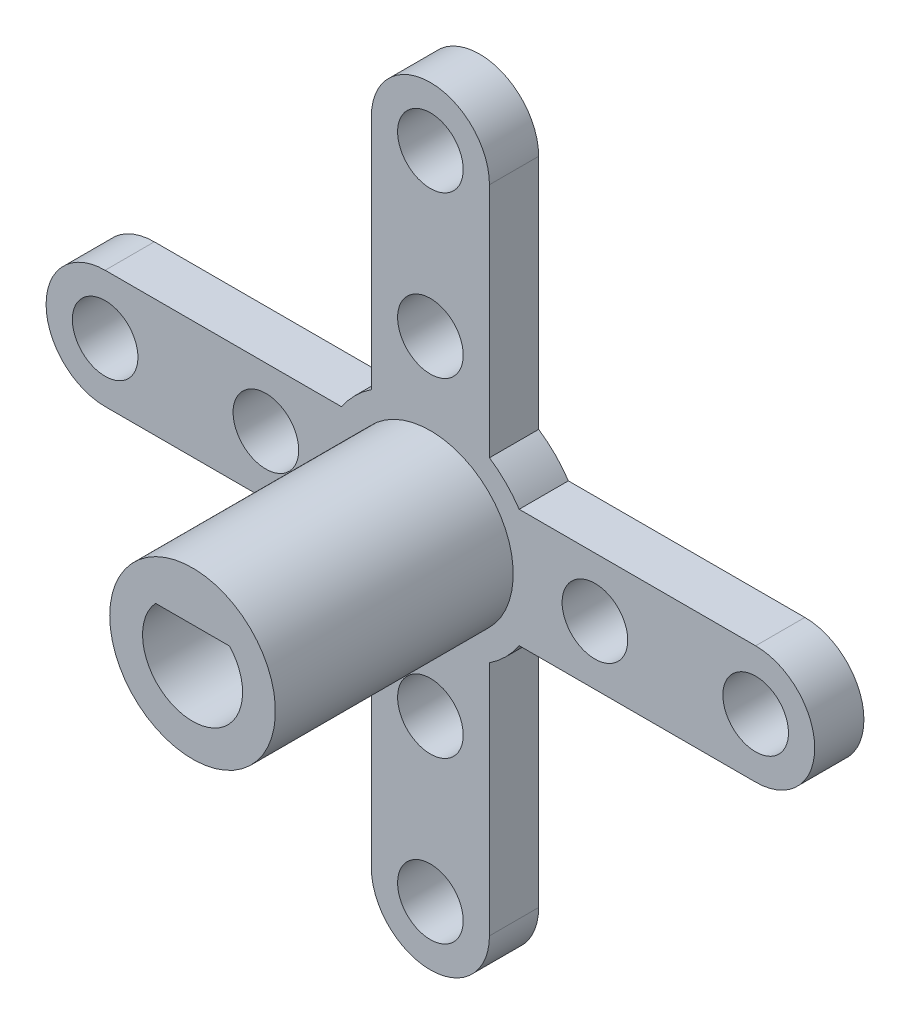
ISO-10303-21;
HEADER;
FILE_DESCRIPTION(('STEP AP214'),'2;1');
FILE_NAME('part.step','',(''),(''),'','','');
FILE_SCHEMA(('AUTOMOTIVE_DESIGN { 1 0 10303 214 1 1 1 1 }'));
ENDSEC;
DATA;
#1=APPLICATION_CONTEXT('core data for automotive mechanical design processes');
#2=APPLICATION_PROTOCOL_DEFINITION('international standard','automotive_design',2000,#1);
#3=PRODUCT_CONTEXT('',#1,'mechanical');
#4=PRODUCT('Part','Part','',(#3));
#5=PRODUCT_RELATED_PRODUCT_CATEGORY('part','',(#4));
#6=PRODUCT_DEFINITION_FORMATION('','',#4);
#7=PRODUCT_DEFINITION_CONTEXT('part definition',#1,'design');
#8=PRODUCT_DEFINITION('design','',#6,#7);
#9=PRODUCT_DEFINITION_SHAPE('','',#8);
#10=(LENGTH_UNIT() NAMED_UNIT(*) SI_UNIT(.MILLI.,.METRE.));
#11=(NAMED_UNIT(*) PLANE_ANGLE_UNIT() SI_UNIT($,.RADIAN.));
#12=(NAMED_UNIT(*) SI_UNIT($,.STERADIAN.) SOLID_ANGLE_UNIT());
#13=UNCERTAINTY_MEASURE_WITH_UNIT(LENGTH_MEASURE(1.E-05),#10,'distance_accuracy_value','');
#14=(GEOMETRIC_REPRESENTATION_CONTEXT(3) GLOBAL_UNCERTAINTY_ASSIGNED_CONTEXT((#13)) GLOBAL_UNIT_ASSIGNED_CONTEXT((#10,
#11,#12)) REPRESENTATION_CONTEXT('',''));
#15=CARTESIAN_POINT('',(0.,0.,0.));
#16=DIRECTION('',(0.,0.,1.));
#17=DIRECTION('',(1.,0.,0.));
#18=AXIS2_PLACEMENT_3D('',#15,#16,#17);
#19=CARTESIAN_POINT('',(0.,0.,1.5));
#20=DIRECTION('',(0.,0.,-1.));
#21=DIRECTION('',(-1.,0.,0.));
#22=AXIS2_PLACEMENT_3D('',#19,#20,#21);
#23=CYLINDRICAL_SURFACE('',#22,3.25);
#24=DIRECTION('',(0.,0.,-1.));
#25=VECTOR('',#24,1.);
#26=CARTESIAN_POINT('',(-2.70601182554696,-1.80000000000001,1.5));
#27=LINE('',#26,#25);
#28=CARTESIAN_POINT('',(-2.70601182554696,-1.80000000000001,1.5));
#29=VERTEX_POINT('',#28);
#30=CARTESIAN_POINT('',(-2.70601182554696,-1.80000000000001,0.));
#31=VERTEX_POINT('',#30);
#32=EDGE_CURVE('E295',#29,#31,#27,.T.);
#33=ORIENTED_EDGE('',*,*,#32,.T.);
#34=CARTESIAN_POINT('',(0.,0.,0.));
#35=DIRECTION('',(0.,0.,1.));
#36=DIRECTION('',(1.,0.,0.));
#37=AXIS2_PLACEMENT_3D('',#34,#35,#36);
#38=CIRCLE('',#37,3.25);
#39=CARTESIAN_POINT('',(-1.79999999999999,-2.70601182554697,0.));
#40=VERTEX_POINT('',#39);
#41=EDGE_CURVE('E341',#31,#40,#38,.T.);
#42=ORIENTED_EDGE('',*,*,#41,.T.);
#43=DIRECTION('',(0.,0.,-1.));
#44=VECTOR('',#43,1.);
#45=CARTESIAN_POINT('',(-1.79999999999999,-2.70601182554697,1.5));
#46=LINE('',#45,#44);
#47=CARTESIAN_POINT('',(-1.79999999999999,-2.70601182554697,1.5));
#48=VERTEX_POINT('',#47);
#49=EDGE_CURVE('E276',#48,#40,#46,.T.);
#50=ORIENTED_EDGE('',*,*,#49,.F.);
#51=CARTESIAN_POINT('',(0.,0.,1.5));
#52=DIRECTION('',(0.,0.,1.));
#53=DIRECTION('',(1.,0.,0.));
#54=AXIS2_PLACEMENT_3D('',#51,#52,#53);
#55=CIRCLE('',#54,3.25);
#56=EDGE_CURVE('E322',#29,#48,#55,.T.);
#57=ORIENTED_EDGE('',*,*,#56,.F.);
#58=EDGE_LOOP('',(#33,#42,#50,#57));
#59=FACE_BOUND('',#58,.T.);
#60=ADVANCED_FACE('F53',(#59),#23,.T.);
#61=DIRECTION('',(0.,0.,-1.));
#62=VECTOR('',#61,1.);
#63=CARTESIAN_POINT('',(2.70601182554695,1.80000000000003,1.5));
#64=LINE('',#63,#62);
#65=CARTESIAN_POINT('',(2.70601182554695,1.80000000000003,1.5));
#66=VERTEX_POINT('',#65);
#67=CARTESIAN_POINT('',(2.70601182554694,1.80000000000003,0.));
#68=VERTEX_POINT('',#67);
#69=EDGE_CURVE('E221',#66,#68,#64,.T.);
#70=ORIENTED_EDGE('',*,*,#69,.T.);
#71=CARTESIAN_POINT('',(1.79999999999999,2.70601182554697,0.));
#72=VERTEX_POINT('',#71);
#73=EDGE_CURVE('E317',#68,#72,#38,.T.);
#74=ORIENTED_EDGE('',*,*,#73,.T.);
#75=DIRECTION('',(0.,0.,-1.));
#76=VECTOR('',#75,1.);
#77=CARTESIAN_POINT('',(1.79999999999999,2.70601182554697,1.5));
#78=LINE('',#77,#76);
#79=CARTESIAN_POINT('',(1.79999999999999,2.70601182554697,1.5));
#80=VERTEX_POINT('',#79);
#81=EDGE_CURVE('E12',#80,#72,#78,.T.);
#82=ORIENTED_EDGE('',*,*,#81,.F.);
#83=EDGE_CURVE('E323',#66,#80,#55,.T.);
#84=ORIENTED_EDGE('',*,*,#83,.F.);
#85=EDGE_LOOP('',(#70,#74,#82,#84));
#86=FACE_BOUND('',#85,.T.);
#87=ADVANCED_FACE('F376',(#86),#23,.T.);
#88=CARTESIAN_POINT('',(1.8,-2.70601182554696,0.));
#89=VERTEX_POINT('',#88);
#90=CARTESIAN_POINT('',(2.70601182554698,-1.79999999999997,0.));
#91=VERTEX_POINT('',#90);
#92=EDGE_CURVE('E378',#89,#91,#38,.T.);
#93=ORIENTED_EDGE('',*,*,#92,.T.);
#94=DIRECTION('',(0.,0.,-1.));
#95=VECTOR('',#94,1.);
#96=CARTESIAN_POINT('',(2.70601182554698,-1.79999999999997,1.5));
#97=LINE('',#96,#95);
#98=CARTESIAN_POINT('',(2.70601182554698,-1.79999999999997,1.5));
#99=VERTEX_POINT('',#98);
#100=EDGE_CURVE('E240',#99,#91,#97,.T.);
#101=ORIENTED_EDGE('',*,*,#100,.F.);
#102=CARTESIAN_POINT('',(1.8,-2.70601182554696,1.5));
#103=VERTEX_POINT('',#102);
#104=EDGE_CURVE('E403',#103,#99,#55,.T.);
#105=ORIENTED_EDGE('',*,*,#104,.F.);
#106=DIRECTION('',(0.,0.,-1.));
#107=VECTOR('',#106,1.);
#108=CARTESIAN_POINT('',(1.8,-2.70601182554696,1.5));
#109=LINE('',#108,#107);
#110=EDGE_CURVE('E76',#103,#89,#109,.T.);
#111=ORIENTED_EDGE('',*,*,#110,.T.);
#112=EDGE_LOOP('',(#93,#101,#105,#111));
#113=FACE_BOUND('',#112,.T.);
#114=ADVANCED_FACE('F415',(#113),#23,.T.);
#115=CARTESIAN_POINT('',(0.,0.,0.));
#116=DIRECTION('',(0.,0.,1.));
#117=DIRECTION('',(1.,0.,0.));
#118=AXIS2_PLACEMENT_3D('',#115,#116,#117);
#119=PLANE('',#118);
#120=CARTESIAN_POINT('',(-1.8,2.70601182554696,0.));
#121=VERTEX_POINT('',#120);
#122=CARTESIAN_POINT('',(-2.70601182554697,1.79999999999999,0.));
#123=VERTEX_POINT('',#122);
#124=EDGE_CURVE('E338',#121,#123,#38,.T.);
#125=ORIENTED_EDGE('',*,*,#124,.F.);
#126=DIRECTION('',(0.,-1.,0.));
#127=VECTOR('',#126,1.);
#128=CARTESIAN_POINT('',(-1.8,0.,0.));
#129=LINE('',#128,#127);
#130=CARTESIAN_POINT('',(-1.8,9.915,0.));
#131=VERTEX_POINT('',#130);
#132=EDGE_CURVE('E346',#131,#121,#129,.T.);
#133=ORIENTED_EDGE('',*,*,#132,.F.);
#134=CARTESIAN_POINT('',(0.,9.915,0.));
#135=DIRECTION('',(0.,0.,1.));
#136=DIRECTION('',(1.,0.,0.));
#137=AXIS2_PLACEMENT_3D('',#134,#135,#136);
#138=CIRCLE('',#137,1.8);
#139=CARTESIAN_POINT('',(1.79999999999999,9.915,0.));
#140=VERTEX_POINT('',#139);
#141=EDGE_CURVE('E344',#140,#131,#138,.T.);
#142=ORIENTED_EDGE('',*,*,#141,.F.);
#143=DIRECTION('',(0.,-1.,0.));
#144=VECTOR('',#143,1.);
#145=CARTESIAN_POINT('',(1.8,0.,0.));
#146=LINE('',#145,#144);
#147=EDGE_CURVE('E340',#140,#72,#146,.T.);
#148=ORIENTED_EDGE('',*,*,#147,.T.);
#149=ORIENTED_EDGE('',*,*,#73,.F.);
#150=DIRECTION('',(-1.,0.,0.));
#151=VECTOR('',#150,1.);
#152=CARTESIAN_POINT('',(0.,1.8,0.));
#153=LINE('',#152,#151);
#154=CARTESIAN_POINT('',(9.91499999999998,1.8000000000001,0.));
#155=VERTEX_POINT('',#154);
#156=EDGE_CURVE('E226',#155,#68,#153,.T.);
#157=ORIENTED_EDGE('',*,*,#156,.F.);
#158=CARTESIAN_POINT('',(9.915,1.075721401061E-13,0.));
#159=DIRECTION('',(0.,0.,1.));
#160=DIRECTION('',(0.,-1.,0.));
#161=AXIS2_PLACEMENT_3D('',#158,#159,#160);
#162=CIRCLE('',#161,1.8);
#163=CARTESIAN_POINT('',(9.91500000000002,-1.79999999999989,0.));
#164=VERTEX_POINT('',#163);
#165=EDGE_CURVE('E224',#164,#155,#162,.T.);
#166=ORIENTED_EDGE('',*,*,#165,.F.);
#167=DIRECTION('',(-1.,0.,0.));
#168=VECTOR('',#167,1.);
#169=CARTESIAN_POINT('',(0.,-1.8,0.));
#170=LINE('',#169,#168);
#171=EDGE_CURVE('E185',#164,#91,#170,.T.);
#172=ORIENTED_EDGE('',*,*,#171,.T.);
#173=ORIENTED_EDGE('',*,*,#92,.F.);
#174=DIRECTION('',(0.,1.,0.));
#175=VECTOR('',#174,1.);
#176=CARTESIAN_POINT('',(1.8,0.,0.));
#177=LINE('',#176,#175);
#178=CARTESIAN_POINT('',(1.8,-9.915,0.));
#179=VERTEX_POINT('',#178);
#180=EDGE_CURVE('E262',#179,#89,#177,.T.);
#181=ORIENTED_EDGE('',*,*,#180,.F.);
#182=CARTESIAN_POINT('',(0.,-9.915,0.));
#183=DIRECTION('',(0.,0.,1.));
#184=DIRECTION('',(-1.,0.,0.));
#185=AXIS2_PLACEMENT_3D('',#182,#183,#184);
#186=CIRCLE('',#185,1.8);
#187=CARTESIAN_POINT('',(-1.79999999999999,-9.915,0.));
#188=VERTEX_POINT('',#187);
#189=EDGE_CURVE('E260',#188,#179,#186,.T.);
#190=ORIENTED_EDGE('',*,*,#189,.F.);
#191=DIRECTION('',(0.,1.,0.));
#192=VECTOR('',#191,1.);
#193=CARTESIAN_POINT('',(-1.8,0.,0.));
#194=LINE('',#193,#192);
#195=EDGE_CURVE('E242',#188,#40,#194,.T.);
#196=ORIENTED_EDGE('',*,*,#195,.T.);
#197=ORIENTED_EDGE('',*,*,#41,.F.);
#198=DIRECTION('',(1.,0.,0.));
#199=VECTOR('',#198,1.);
#200=CARTESIAN_POINT('',(0.,-1.8,0.));
#201=LINE('',#200,#199);
#202=CARTESIAN_POINT('',(-9.915,-1.80000000000003,0.));
#203=VERTEX_POINT('',#202);
#204=EDGE_CURVE('E300',#203,#31,#201,.T.);
#205=ORIENTED_EDGE('',*,*,#204,.F.);
#206=CARTESIAN_POINT('',(-9.915,0.,0.));
#207=DIRECTION('',(0.,0.,1.));
#208=DIRECTION('',(0.,1.,0.));
#209=AXIS2_PLACEMENT_3D('',#206,#207,#208);
#210=CIRCLE('',#209,1.8);
#211=CARTESIAN_POINT('',(-9.91500000000001,1.79999999999996,0.));
#212=VERTEX_POINT('',#211);
#213=EDGE_CURVE('E298',#212,#203,#210,.T.);
#214=ORIENTED_EDGE('',*,*,#213,.F.);
#215=DIRECTION('',(1.,0.,0.));
#216=VECTOR('',#215,1.);
#217=CARTESIAN_POINT('',(0.,1.8,0.));
#218=LINE('',#217,#216);
#219=EDGE_CURVE('E279',#212,#123,#218,.T.);
#220=ORIENTED_EDGE('',*,*,#219,.T.);
#221=EDGE_LOOP('',(#125,#133,#142,#148,#149,#157,#166,#172,#173,#181,#190,#196,#197,#205,#214,#220));
#222=FACE_BOUND('',#221,.T.);
#223=CARTESIAN_POINT('',(5.015,0.,0.));
#224=DIRECTION('',(0.,0.,1.));
#225=DIRECTION('',(0.,-1.,0.));
#226=AXIS2_PLACEMENT_3D('',#223,#224,#225);
#227=CIRCLE('',#226,1.);
#228=CARTESIAN_POINT('',(5.01500000000001,-0.999999999999948,0.));
#229=VERTEX_POINT('',#228);
#230=EDGE_CURVE('E210',#229,#229,#227,.T.);
#231=ORIENTED_EDGE('',*,*,#230,.T.);
#232=EDGE_LOOP('',(#231));
#233=FACE_BOUND('',#232,.T.);
#234=CARTESIAN_POINT('',(9.915,1.075721401061E-13,0.));
#235=DIRECTION('',(0.,0.,1.));
#236=DIRECTION('',(0.,-1.,0.));
#237=AXIS2_PLACEMENT_3D('',#234,#235,#236);
#238=CIRCLE('',#237,1.);
#239=CARTESIAN_POINT('',(9.91500000000001,-0.999999999999893,0.));
#240=VERTEX_POINT('',#239);
#241=EDGE_CURVE('E228',#240,#240,#238,.T.);
#242=ORIENTED_EDGE('',*,*,#241,.T.);
#243=EDGE_LOOP('',(#242));
#244=FACE_BOUND('',#243,.T.);
#245=CARTESIAN_POINT('',(0.,-5.015,0.));
#246=DIRECTION('',(0.,0.,1.));
#247=DIRECTION('',(-1.,0.,0.));
#248=AXIS2_PLACEMENT_3D('',#245,#246,#247);
#249=CIRCLE('',#248,1.);
#250=CARTESIAN_POINT('',(-1.,-5.015,0.));
#251=VERTEX_POINT('',#250);
#252=EDGE_CURVE('E247',#251,#251,#249,.T.);
#253=ORIENTED_EDGE('',*,*,#252,.T.);
#254=EDGE_LOOP('',(#253));
#255=FACE_BOUND('',#254,.T.);
#256=CARTESIAN_POINT('',(0.,-9.915,0.));
#257=DIRECTION('',(0.,0.,1.));
#258=DIRECTION('',(-1.,0.,0.));
#259=AXIS2_PLACEMENT_3D('',#256,#257,#258);
#260=CIRCLE('',#259,1.);
#261=CARTESIAN_POINT('',(-0.999999999999997,-9.915,0.));
#262=VERTEX_POINT('',#261);
#263=EDGE_CURVE('E265',#262,#262,#260,.T.);
#264=ORIENTED_EDGE('',*,*,#263,.T.);
#265=EDGE_LOOP('',(#264));
#266=FACE_BOUND('',#265,.T.);
#267=CARTESIAN_POINT('',(-9.915,0.,0.));
#268=DIRECTION('',(0.,0.,1.));
#269=DIRECTION('',(0.,1.,0.));
#270=AXIS2_PLACEMENT_3D('',#267,#268,#269);
#271=CIRCLE('',#270,1.);
#272=CARTESIAN_POINT('',(-9.915,0.999999999999962,0.));
#273=VERTEX_POINT('',#272);
#274=EDGE_CURVE('E303',#273,#273,#271,.T.);
#275=ORIENTED_EDGE('',*,*,#274,.T.);
#276=EDGE_LOOP('',(#275));
#277=FACE_BOUND('',#276,.T.);
#278=CARTESIAN_POINT('',(-5.015,0.,0.));
#279=DIRECTION('',(0.,0.,1.));
#280=DIRECTION('',(0.,1.,0.));
#281=AXIS2_PLACEMENT_3D('',#278,#279,#280);
#282=CIRCLE('',#281,1.);
#283=CARTESIAN_POINT('',(-5.015,0.999999999999983,0.));
#284=VERTEX_POINT('',#283);
#285=EDGE_CURVE('E284',#284,#284,#282,.T.);
#286=ORIENTED_EDGE('',*,*,#285,.T.);
#287=EDGE_LOOP('',(#286));
#288=FACE_BOUND('',#287,.T.);
#289=CARTESIAN_POINT('',(0.,9.915,0.));
#290=DIRECTION('',(0.,0.,1.));
#291=DIRECTION('',(1.,0.,0.));
#292=AXIS2_PLACEMENT_3D('',#289,#290,#291);
#293=CIRCLE('',#292,1.);
#294=CARTESIAN_POINT('',(0.999999999999997,9.915,0.));
#295=VERTEX_POINT('',#294);
#296=EDGE_CURVE('E349',#295,#295,#293,.T.);
#297=ORIENTED_EDGE('',*,*,#296,.T.);
#298=EDGE_LOOP('',(#297));
#299=FACE_BOUND('',#298,.T.);
#300=CARTESIAN_POINT('',(0.,5.015,0.));
#301=DIRECTION('',(0.,0.,1.));
#302=DIRECTION('',(1.,0.,0.));
#303=AXIS2_PLACEMENT_3D('',#300,#301,#302);
#304=CIRCLE('',#303,1.);
#305=CARTESIAN_POINT('',(1.,5.015,0.));
#306=VERTEX_POINT('',#305);
#307=EDGE_CURVE('E352',#306,#306,#304,.T.);
#308=ORIENTED_EDGE('',*,*,#307,.T.);
#309=EDGE_LOOP('',(#308));
#310=FACE_BOUND('',#309,.T.);
#311=ADVANCED_FACE('F369',(#222,#233,#244,#255,#266,#277,#288,#299,#310),#119,.F.);
#312=ORIENTED_EDGE('',*,*,#124,.T.);
#313=DIRECTION('',(0.,0.,-1.));
#314=VECTOR('',#313,1.);
#315=CARTESIAN_POINT('',(-2.70601182554697,1.79999999999999,1.5));
#316=LINE('',#315,#314);
#317=CARTESIAN_POINT('',(-2.70601182554697,1.79999999999999,1.5));
#318=VERTEX_POINT('',#317);
#319=EDGE_CURVE('E314',#318,#123,#316,.T.);
#320=ORIENTED_EDGE('',*,*,#319,.F.);
#321=CARTESIAN_POINT('',(-1.8,2.70601182554696,1.5));
#322=VERTEX_POINT('',#321);
#323=EDGE_CURVE('E318',#322,#318,#55,.T.);
#324=ORIENTED_EDGE('',*,*,#323,.F.);
#325=DIRECTION('',(0.,0.,-1.));
#326=VECTOR('',#325,1.);
#327=CARTESIAN_POINT('',(-1.8,2.70601182554696,1.5));
#328=LINE('',#327,#326);
#329=EDGE_CURVE('E337',#322,#121,#328,.T.);
#330=ORIENTED_EDGE('',*,*,#329,.T.);
#331=EDGE_LOOP('',(#312,#320,#324,#330));
#332=FACE_BOUND('',#331,.T.);
#333=ADVANCED_FACE('F55',(#332),#23,.T.);
#334=CARTESIAN_POINT('',(0.,0.,1.5));
#335=DIRECTION('',(0.,0.,1.));
#336=DIRECTION('',(1.,0.,0.));
#337=AXIS2_PLACEMENT_3D('',#334,#335,#336);
#338=PLANE('',#337);
#339=CARTESIAN_POINT('',(0.,0.,1.5));
#340=DIRECTION('',(0.,0.,1.));
#341=DIRECTION('',(1.,0.,0.));
#342=AXIS2_PLACEMENT_3D('',#339,#340,#341);
#343=CIRCLE('',#342,2.525);
#344=CARTESIAN_POINT('',(-2.525,0.,1.5));
#345=VERTEX_POINT('',#344);
#346=EDGE_CURVE('E196',#345,#345,#343,.T.);
#347=ORIENTED_EDGE('',*,*,#346,.F.);
#348=EDGE_LOOP('',(#347));
#349=FACE_BOUND('',#348,.T.);
#350=ORIENTED_EDGE('',*,*,#83,.T.);
#351=DIRECTION('',(0.,-1.,0.));
#352=VECTOR('',#351,1.);
#353=CARTESIAN_POINT('',(1.8,0.,1.5));
#354=LINE('',#353,#352);
#355=CARTESIAN_POINT('',(1.79999999999999,9.915,1.5));
#356=VERTEX_POINT('',#355);
#357=EDGE_CURVE('E321',#356,#80,#354,.T.);
#358=ORIENTED_EDGE('',*,*,#357,.F.);
#359=CARTESIAN_POINT('',(0.,9.915,1.5));
#360=DIRECTION('',(0.,0.,1.));
#361=DIRECTION('',(1.,0.,0.));
#362=AXIS2_PLACEMENT_3D('',#359,#360,#361);
#363=CIRCLE('',#362,1.8);
#364=CARTESIAN_POINT('',(-1.8,9.915,1.5));
#365=VERTEX_POINT('',#364);
#366=EDGE_CURVE('E326',#356,#365,#363,.T.);
#367=ORIENTED_EDGE('',*,*,#366,.T.);
#368=DIRECTION('',(0.,-1.,0.));
#369=VECTOR('',#368,1.);
#370=CARTESIAN_POINT('',(-1.8,0.,1.5));
#371=LINE('',#370,#369);
#372=EDGE_CURVE('E328',#365,#322,#371,.T.);
#373=ORIENTED_EDGE('',*,*,#372,.T.);
#374=ORIENTED_EDGE('',*,*,#323,.T.);
#375=DIRECTION('',(1.,0.,0.));
#376=VECTOR('',#375,1.);
#377=CARTESIAN_POINT('',(0.,1.8,1.5));
#378=LINE('',#377,#376);
#379=CARTESIAN_POINT('',(-9.91500000000001,1.79999999999996,1.5));
#380=VERTEX_POINT('',#379);
#381=EDGE_CURVE('E280',#380,#318,#378,.T.);
#382=ORIENTED_EDGE('',*,*,#381,.F.);
#383=CARTESIAN_POINT('',(-9.915,0.,1.5));
#384=DIRECTION('',(0.,0.,1.));
#385=DIRECTION('',(0.,1.,0.));
#386=AXIS2_PLACEMENT_3D('',#383,#384,#385);
#387=CIRCLE('',#386,1.8);
#388=CARTESIAN_POINT('',(-9.915,-1.80000000000003,1.5));
#389=VERTEX_POINT('',#388);
#390=EDGE_CURVE('E283',#380,#389,#387,.T.);
#391=ORIENTED_EDGE('',*,*,#390,.T.);
#392=DIRECTION('',(1.,0.,0.));
#393=VECTOR('',#392,1.);
#394=CARTESIAN_POINT('',(0.,-1.8,1.5));
#395=LINE('',#394,#393);
#396=EDGE_CURVE('E286',#389,#29,#395,.T.);
#397=ORIENTED_EDGE('',*,*,#396,.T.);
#398=ORIENTED_EDGE('',*,*,#56,.T.);
#399=DIRECTION('',(0.,1.,0.));
#400=VECTOR('',#399,1.);
#401=CARTESIAN_POINT('',(-1.8,0.,1.5));
#402=LINE('',#401,#400);
#403=CARTESIAN_POINT('',(-1.79999999999999,-9.915,1.5));
#404=VERTEX_POINT('',#403);
#405=EDGE_CURVE('E243',#404,#48,#402,.T.);
#406=ORIENTED_EDGE('',*,*,#405,.F.);
#407=CARTESIAN_POINT('',(0.,-9.915,1.5));
#408=DIRECTION('',(0.,0.,1.));
#409=DIRECTION('',(-1.,0.,0.));
#410=AXIS2_PLACEMENT_3D('',#407,#408,#409);
#411=CIRCLE('',#410,1.8);
#412=CARTESIAN_POINT('',(1.8,-9.915,1.5));
#413=VERTEX_POINT('',#412);
#414=EDGE_CURVE('E246',#404,#413,#411,.T.);
#415=ORIENTED_EDGE('',*,*,#414,.T.);
#416=DIRECTION('',(0.,1.,0.));
#417=VECTOR('',#416,1.);
#418=CARTESIAN_POINT('',(1.8,0.,1.5));
#419=LINE('',#418,#417);
#420=EDGE_CURVE('E249',#413,#103,#419,.T.);
#421=ORIENTED_EDGE('',*,*,#420,.T.);
#422=ORIENTED_EDGE('',*,*,#104,.T.);
#423=DIRECTION('',(-1.,0.,0.));
#424=VECTOR('',#423,1.);
#425=CARTESIAN_POINT('',(0.,-1.8,1.5));
#426=LINE('',#425,#424);
#427=CARTESIAN_POINT('',(9.91500000000002,-1.79999999999989,1.5));
#428=VERTEX_POINT('',#427);
#429=EDGE_CURVE('E207',#428,#99,#426,.T.);
#430=ORIENTED_EDGE('',*,*,#429,.F.);
#431=CARTESIAN_POINT('',(9.915,1.075721401061E-13,1.5));
#432=DIRECTION('',(0.,0.,1.));
#433=DIRECTION('',(0.,-1.,0.));
#434=AXIS2_PLACEMENT_3D('',#431,#432,#433);
#435=CIRCLE('',#434,1.8);
#436=CARTESIAN_POINT('',(9.91499999999998,1.8000000000001,1.5));
#437=VERTEX_POINT('',#436);
#438=EDGE_CURVE('E209',#428,#437,#435,.T.);
#439=ORIENTED_EDGE('',*,*,#438,.T.);
#440=DIRECTION('',(-1.,0.,0.));
#441=VECTOR('',#440,1.);
#442=CARTESIAN_POINT('',(0.,1.8,1.5));
#443=LINE('',#442,#441);
#444=EDGE_CURVE('E212',#437,#66,#443,.T.);
#445=ORIENTED_EDGE('',*,*,#444,.T.);
#446=EDGE_LOOP('',(#350,#358,#367,#373,#374,#382,#391,#397,#398,#406,#415,#421,#422,#430,#439,#445));
#447=FACE_BOUND('',#446,.T.);
#448=CARTESIAN_POINT('',(0.,5.015,1.5));
#449=DIRECTION('',(0.,0.,1.));
#450=DIRECTION('',(1.,0.,0.));
#451=AXIS2_PLACEMENT_3D('',#448,#449,#450);
#452=CIRCLE('',#451,1.);
#453=CARTESIAN_POINT('',(1.,5.015,1.5));
#454=VERTEX_POINT('',#453);
#455=EDGE_CURVE('E334',#454,#454,#452,.T.);
#456=ORIENTED_EDGE('',*,*,#455,.F.);
#457=EDGE_LOOP('',(#456));
#458=FACE_BOUND('',#457,.T.);
#459=CARTESIAN_POINT('',(0.,9.915,1.5));
#460=DIRECTION('',(0.,0.,1.));
#461=DIRECTION('',(1.,0.,0.));
#462=AXIS2_PLACEMENT_3D('',#459,#460,#461);
#463=CIRCLE('',#462,1.);
#464=CARTESIAN_POINT('',(0.999999999999997,9.915,1.5));
#465=VERTEX_POINT('',#464);
#466=EDGE_CURVE('E331',#465,#465,#463,.T.);
#467=ORIENTED_EDGE('',*,*,#466,.F.);
#468=EDGE_LOOP('',(#467));
#469=FACE_BOUND('',#468,.T.);
#470=CARTESIAN_POINT('',(9.915,1.075721401061E-13,1.5));
#471=DIRECTION('',(0.,0.,1.));
#472=DIRECTION('',(0.,-1.,0.));
#473=AXIS2_PLACEMENT_3D('',#470,#471,#472);
#474=CIRCLE('',#473,1.);
#475=CARTESIAN_POINT('',(9.91500000000001,-0.999999999999893,1.5));
#476=VERTEX_POINT('',#475);
#477=EDGE_CURVE('E215',#476,#476,#474,.T.);
#478=ORIENTED_EDGE('',*,*,#477,.F.);
#479=EDGE_LOOP('',(#478));
#480=FACE_BOUND('',#479,.T.);
#481=CARTESIAN_POINT('',(5.015,0.,1.5));
#482=DIRECTION('',(0.,0.,1.));
#483=DIRECTION('',(0.,-1.,0.));
#484=AXIS2_PLACEMENT_3D('',#481,#482,#483);
#485=CIRCLE('',#484,1.);
#486=CARTESIAN_POINT('',(5.01500000000001,-0.999999999999948,1.5));
#487=VERTEX_POINT('',#486);
#488=EDGE_CURVE('E218',#487,#487,#485,.T.);
#489=ORIENTED_EDGE('',*,*,#488,.F.);
#490=EDGE_LOOP('',(#489));
#491=FACE_BOUND('',#490,.T.);
#492=CARTESIAN_POINT('',(0.,-5.015,1.5));
#493=DIRECTION('',(0.,0.,1.));
#494=DIRECTION('',(-1.,0.,0.));
#495=AXIS2_PLACEMENT_3D('',#492,#493,#494);
#496=CIRCLE('',#495,1.);
#497=CARTESIAN_POINT('',(-1.,-5.015,1.5));
#498=VERTEX_POINT('',#497);
#499=EDGE_CURVE('E255',#498,#498,#496,.T.);
#500=ORIENTED_EDGE('',*,*,#499,.F.);
#501=EDGE_LOOP('',(#500));
#502=FACE_BOUND('',#501,.T.);
#503=CARTESIAN_POINT('',(0.,-9.915,1.5));
#504=DIRECTION('',(0.,0.,1.));
#505=DIRECTION('',(-1.,0.,0.));
#506=AXIS2_PLACEMENT_3D('',#503,#504,#505);
#507=CIRCLE('',#506,1.);
#508=CARTESIAN_POINT('',(-0.999999999999997,-9.915,1.5));
#509=VERTEX_POINT('',#508);
#510=EDGE_CURVE('E252',#509,#509,#507,.T.);
#511=ORIENTED_EDGE('',*,*,#510,.F.);
#512=EDGE_LOOP('',(#511));
#513=FACE_BOUND('',#512,.T.);
#514=CARTESIAN_POINT('',(-9.915,0.,1.5));
#515=DIRECTION('',(0.,0.,1.));
#516=DIRECTION('',(0.,1.,0.));
#517=AXIS2_PLACEMENT_3D('',#514,#515,#516);
#518=CIRCLE('',#517,1.);
#519=CARTESIAN_POINT('',(-9.915,0.999999999999962,1.5));
#520=VERTEX_POINT('',#519);
#521=EDGE_CURVE('E289',#520,#520,#518,.T.);
#522=ORIENTED_EDGE('',*,*,#521,.F.);
#523=EDGE_LOOP('',(#522));
#524=FACE_BOUND('',#523,.T.);
#525=CARTESIAN_POINT('',(-5.015,0.,1.5));
#526=DIRECTION('',(0.,0.,1.));
#527=DIRECTION('',(0.,1.,0.));
#528=AXIS2_PLACEMENT_3D('',#525,#526,#527);
#529=CIRCLE('',#528,1.);
#530=CARTESIAN_POINT('',(-5.015,0.999999999999983,1.5));
#531=VERTEX_POINT('',#530);
#532=EDGE_CURVE('E292',#531,#531,#529,.T.);
#533=ORIENTED_EDGE('',*,*,#532,.F.);
#534=EDGE_LOOP('',(#533));
#535=FACE_BOUND('',#534,.T.);
#536=ADVANCED_FACE('F400',(#349,#447,#458,#469,#480,#491,#502,#513,#524,#535),#338,.T.);
#537=CARTESIAN_POINT('',(1.8,0.,1.5));
#538=DIRECTION('',(1.,0.,0.));
#539=DIRECTION('',(0.,1.,0.));
#540=AXIS2_PLACEMENT_3D('',#537,#538,#539);
#541=PLANE('',#540);
#542=ORIENTED_EDGE('',*,*,#147,.F.);
#543=DIRECTION('',(0.,0.,-1.));
#544=VECTOR('',#543,1.);
#545=CARTESIAN_POINT('',(1.79999999999999,9.915,1.5));
#546=LINE('',#545,#544);
#547=EDGE_CURVE('E61',#356,#140,#546,.T.);
#548=ORIENTED_EDGE('',*,*,#547,.F.);
#549=ORIENTED_EDGE('',*,*,#357,.T.);
#550=ORIENTED_EDGE('',*,*,#81,.T.);
#551=EDGE_LOOP('',(#542,#548,#549,#550));
#552=FACE_BOUND('',#551,.T.);
#553=ADVANCED_FACE('F372',(#552),#541,.T.);
#554=CARTESIAN_POINT('',(0.,9.915,1.5));
#555=DIRECTION('',(0.,0.,-1.));
#556=DIRECTION('',(-1.,0.,0.));
#557=AXIS2_PLACEMENT_3D('',#554,#555,#556);
#558=CYLINDRICAL_SURFACE('',#557,1.8);
#559=ORIENTED_EDGE('',*,*,#141,.T.);
#560=DIRECTION('',(0.,0.,-1.));
#561=VECTOR('',#560,1.);
#562=CARTESIAN_POINT('',(-1.8,9.915,1.5));
#563=LINE('',#562,#561);
#564=EDGE_CURVE('E356',#365,#131,#563,.T.);
#565=ORIENTED_EDGE('',*,*,#564,.F.);
#566=ORIENTED_EDGE('',*,*,#366,.F.);
#567=ORIENTED_EDGE('',*,*,#547,.T.);
#568=EDGE_LOOP('',(#559,#565,#566,#567));
#569=FACE_BOUND('',#568,.T.);
#570=ADVANCED_FACE('F361',(#569),#558,.T.);
#571=CARTESIAN_POINT('',(-1.8,0.,1.5));
#572=DIRECTION('',(1.,0.,0.));
#573=DIRECTION('',(0.,1.,0.));
#574=AXIS2_PLACEMENT_3D('',#571,#572,#573);
#575=PLANE('',#574);
#576=ORIENTED_EDGE('',*,*,#132,.T.);
#577=ORIENTED_EDGE('',*,*,#329,.F.);
#578=ORIENTED_EDGE('',*,*,#372,.F.);
#579=ORIENTED_EDGE('',*,*,#564,.T.);
#580=EDGE_LOOP('',(#576,#577,#578,#579));
#581=FACE_BOUND('',#580,.T.);
#582=ADVANCED_FACE('F686',(#581),#575,.F.);
#583=CARTESIAN_POINT('',(0.,9.915,1.5));
#584=DIRECTION('',(0.,0.,-1.));
#585=DIRECTION('',(-1.,0.,0.));
#586=AXIS2_PLACEMENT_3D('',#583,#584,#585);
#587=CYLINDRICAL_SURFACE('',#586,1.);
#588=ORIENTED_EDGE('',*,*,#466,.T.);
#589=EDGE_LOOP('',(#588));
#590=FACE_BOUND('',#589,.T.);
#591=ORIENTED_EDGE('',*,*,#296,.F.);
#592=EDGE_LOOP('',(#591));
#593=FACE_BOUND('',#592,.T.);
#594=ADVANCED_FACE('F682',(#590,#593),#587,.F.);
#595=CARTESIAN_POINT('',(0.,5.015,1.5));
#596=DIRECTION('',(0.,0.,-1.));
#597=DIRECTION('',(-1.,0.,0.));
#598=AXIS2_PLACEMENT_3D('',#595,#596,#597);
#599=CYLINDRICAL_SURFACE('',#598,1.);
#600=ORIENTED_EDGE('',*,*,#455,.T.);
#601=EDGE_LOOP('',(#600));
#602=FACE_BOUND('',#601,.T.);
#603=ORIENTED_EDGE('',*,*,#307,.F.);
#604=EDGE_LOOP('',(#603));
#605=FACE_BOUND('',#604,.T.);
#606=ADVANCED_FACE('F466',(#602,#605),#599,.F.);
#607=CARTESIAN_POINT('',(0.,-9.915,1.5));
#608=DIRECTION('',(0.,0.,-1.));
#609=DIRECTION('',(1.,0.,0.));
#610=AXIS2_PLACEMENT_3D('',#607,#608,#609);
#611=CYLINDRICAL_SURFACE('',#610,1.);
#612=ORIENTED_EDGE('',*,*,#510,.T.);
#613=EDGE_LOOP('',(#612));
#614=FACE_BOUND('',#613,.T.);
#615=ORIENTED_EDGE('',*,*,#263,.F.);
#616=EDGE_LOOP('',(#615));
#617=FACE_BOUND('',#616,.T.);
#618=ADVANCED_FACE('F460',(#614,#617),#611,.F.);
#619=CARTESIAN_POINT('',(0.,-5.015,1.5));
#620=DIRECTION('',(0.,0.,-1.));
#621=DIRECTION('',(1.,0.,0.));
#622=AXIS2_PLACEMENT_3D('',#619,#620,#621);
#623=CYLINDRICAL_SURFACE('',#622,1.);
#624=ORIENTED_EDGE('',*,*,#499,.T.);
#625=EDGE_LOOP('',(#624));
#626=FACE_BOUND('',#625,.T.);
#627=ORIENTED_EDGE('',*,*,#252,.F.);
#628=EDGE_LOOP('',(#627));
#629=FACE_BOUND('',#628,.T.);
#630=ADVANCED_FACE('F465',(#626,#629),#623,.F.);
#631=CARTESIAN_POINT('',(0.,-9.915,1.5));
#632=DIRECTION('',(0.,0.,-1.));
#633=DIRECTION('',(1.,0.,0.));
#634=AXIS2_PLACEMENT_3D('',#631,#632,#633);
#635=CYLINDRICAL_SURFACE('',#634,1.8);
#636=ORIENTED_EDGE('',*,*,#189,.T.);
#637=DIRECTION('',(0.,0.,-1.));
#638=VECTOR('',#637,1.);
#639=CARTESIAN_POINT('',(1.8,-9.915,1.5));
#640=LINE('',#639,#638);
#641=EDGE_CURVE('E271',#413,#179,#640,.T.);
#642=ORIENTED_EDGE('',*,*,#641,.F.);
#643=ORIENTED_EDGE('',*,*,#414,.F.);
#644=DIRECTION('',(0.,0.,-1.));
#645=VECTOR('',#644,1.);
#646=CARTESIAN_POINT('',(-1.79999999999999,-9.915,1.5));
#647=LINE('',#646,#645);
#648=EDGE_CURVE('E274',#404,#188,#647,.T.);
#649=ORIENTED_EDGE('',*,*,#648,.T.);
#650=EDGE_LOOP('',(#636,#642,#643,#649));
#651=FACE_BOUND('',#650,.T.);
#652=ADVANCED_FACE('F393',(#651),#635,.T.);
#653=CARTESIAN_POINT('',(1.8,0.,1.5));
#654=DIRECTION('',(-1.,0.,0.));
#655=DIRECTION('',(0.,-1.,0.));
#656=AXIS2_PLACEMENT_3D('',#653,#654,#655);
#657=PLANE('',#656);
#658=ORIENTED_EDGE('',*,*,#180,.T.);
#659=ORIENTED_EDGE('',*,*,#110,.F.);
#660=ORIENTED_EDGE('',*,*,#420,.F.);
#661=ORIENTED_EDGE('',*,*,#641,.T.);
#662=EDGE_LOOP('',(#658,#659,#660,#661));
#663=FACE_BOUND('',#662,.T.);
#664=ADVANCED_FACE('F397',(#663),#657,.F.);
#665=CARTESIAN_POINT('',(-1.8,0.,1.5));
#666=DIRECTION('',(-1.,0.,0.));
#667=DIRECTION('',(0.,-1.,0.));
#668=AXIS2_PLACEMENT_3D('',#665,#666,#667);
#669=PLANE('',#668);
#670=ORIENTED_EDGE('',*,*,#195,.F.);
#671=ORIENTED_EDGE('',*,*,#648,.F.);
#672=ORIENTED_EDGE('',*,*,#405,.T.);
#673=ORIENTED_EDGE('',*,*,#49,.T.);
#674=EDGE_LOOP('',(#670,#671,#672,#673));
#675=FACE_BOUND('',#674,.T.);
#676=ADVANCED_FACE('F387',(#675),#669,.T.);
#677=CARTESIAN_POINT('',(5.015,0.,1.5));
#678=DIRECTION('',(0.,0.,-1.));
#679=DIRECTION('',(0.,1.,0.));
#680=AXIS2_PLACEMENT_3D('',#677,#678,#679);
#681=CYLINDRICAL_SURFACE('',#680,1.);
#682=ORIENTED_EDGE('',*,*,#488,.T.);
#683=EDGE_LOOP('',(#682));
#684=FACE_BOUND('',#683,.T.);
#685=ORIENTED_EDGE('',*,*,#230,.F.);
#686=EDGE_LOOP('',(#685));
#687=FACE_BOUND('',#686,.T.);
#688=ADVANCED_FACE('F502',(#684,#687),#681,.F.);
#689=CARTESIAN_POINT('',(9.915,1.075721401061E-13,1.5));
#690=DIRECTION('',(0.,0.,-1.));
#691=DIRECTION('',(0.,1.,0.));
#692=AXIS2_PLACEMENT_3D('',#689,#690,#691);
#693=CYLINDRICAL_SURFACE('',#692,1.);
#694=ORIENTED_EDGE('',*,*,#477,.T.);
#695=EDGE_LOOP('',(#694));
#696=FACE_BOUND('',#695,.T.);
#697=ORIENTED_EDGE('',*,*,#241,.F.);
#698=EDGE_LOOP('',(#697));
#699=FACE_BOUND('',#698,.T.);
#700=ADVANCED_FACE('F511',(#696,#699),#693,.F.);
#701=CARTESIAN_POINT('',(9.915,1.075721401061E-13,1.5));
#702=DIRECTION('',(0.,0.,-1.));
#703=DIRECTION('',(0.,1.,0.));
#704=AXIS2_PLACEMENT_3D('',#701,#702,#703);
#705=CYLINDRICAL_SURFACE('',#704,1.8);
#706=ORIENTED_EDGE('',*,*,#165,.T.);
#707=DIRECTION('',(0.,0.,-1.));
#708=VECTOR('',#707,1.);
#709=CARTESIAN_POINT('',(9.91499999999998,1.8000000000001,1.5));
#710=LINE('',#709,#708);
#711=EDGE_CURVE('E235',#437,#155,#710,.T.);
#712=ORIENTED_EDGE('',*,*,#711,.F.);
#713=ORIENTED_EDGE('',*,*,#438,.F.);
#714=DIRECTION('',(0.,0.,-1.));
#715=VECTOR('',#714,1.);
#716=CARTESIAN_POINT('',(9.91500000000002,-1.79999999999989,1.5));
#717=LINE('',#716,#715);
#718=EDGE_CURVE('E238',#428,#164,#717,.T.);
#719=ORIENTED_EDGE('',*,*,#718,.T.);
#720=EDGE_LOOP('',(#706,#712,#713,#719));
#721=FACE_BOUND('',#720,.T.);
#722=ADVANCED_FACE('F521',(#721),#705,.T.);
#723=CARTESIAN_POINT('',(0.,1.8,1.5));
#724=DIRECTION('',(0.,-1.,0.));
#725=DIRECTION('',(1.,0.,0.));
#726=AXIS2_PLACEMENT_3D('',#723,#724,#725);
#727=PLANE('',#726);
#728=ORIENTED_EDGE('',*,*,#156,.T.);
#729=ORIENTED_EDGE('',*,*,#69,.F.);
#730=ORIENTED_EDGE('',*,*,#444,.F.);
#731=ORIENTED_EDGE('',*,*,#711,.T.);
#732=EDGE_LOOP('',(#728,#729,#730,#731));
#733=FACE_BOUND('',#732,.T.);
#734=ADVANCED_FACE('F409',(#733),#727,.F.);
#735=CARTESIAN_POINT('',(0.,-1.8,1.5));
#736=DIRECTION('',(0.,-1.,0.));
#737=DIRECTION('',(1.,0.,0.));
#738=AXIS2_PLACEMENT_3D('',#735,#736,#737);
#739=PLANE('',#738);
#740=ORIENTED_EDGE('',*,*,#171,.F.);
#741=ORIENTED_EDGE('',*,*,#718,.F.);
#742=ORIENTED_EDGE('',*,*,#429,.T.);
#743=ORIENTED_EDGE('',*,*,#100,.T.);
#744=EDGE_LOOP('',(#740,#741,#742,#743));
#745=FACE_BOUND('',#744,.T.);
#746=ADVANCED_FACE('F414',(#745),#739,.T.);
#747=CARTESIAN_POINT('',(0.,1.8,1.5));
#748=DIRECTION('',(0.,1.,0.));
#749=DIRECTION('',(-1.,0.,0.));
#750=AXIS2_PLACEMENT_3D('',#747,#748,#749);
#751=PLANE('',#750);
#752=ORIENTED_EDGE('',*,*,#219,.F.);
#753=DIRECTION('',(0.,0.,-1.));
#754=VECTOR('',#753,1.);
#755=CARTESIAN_POINT('',(-9.91500000000001,1.79999999999996,1.5));
#756=LINE('',#755,#754);
#757=EDGE_CURVE('E312',#380,#212,#756,.T.);
#758=ORIENTED_EDGE('',*,*,#757,.F.);
#759=ORIENTED_EDGE('',*,*,#381,.T.);
#760=ORIENTED_EDGE('',*,*,#319,.T.);
#761=EDGE_LOOP('',(#752,#758,#759,#760));
#762=FACE_BOUND('',#761,.T.);
#763=ADVANCED_FACE('F547',(#762),#751,.T.);
#764=CARTESIAN_POINT('',(-9.915,0.,1.5));
#765=DIRECTION('',(0.,0.,-1.));
#766=DIRECTION('',(0.,-1.,0.));
#767=AXIS2_PLACEMENT_3D('',#764,#765,#766);
#768=CYLINDRICAL_SURFACE('',#767,1.8);
#769=ORIENTED_EDGE('',*,*,#213,.T.);
#770=DIRECTION('',(0.,0.,-1.));
#771=VECTOR('',#770,1.);
#772=CARTESIAN_POINT('',(-9.915,-1.80000000000003,1.5));
#773=LINE('',#772,#771);
#774=EDGE_CURVE('E309',#389,#203,#773,.T.);
#775=ORIENTED_EDGE('',*,*,#774,.F.);
#776=ORIENTED_EDGE('',*,*,#390,.F.);
#777=ORIENTED_EDGE('',*,*,#757,.T.);
#778=EDGE_LOOP('',(#769,#775,#776,#777));
#779=FACE_BOUND('',#778,.T.);
#780=ADVANCED_FACE('F556',(#779),#768,.T.);
#781=CARTESIAN_POINT('',(0.,-1.8,1.5));
#782=DIRECTION('',(0.,1.,0.));
#783=DIRECTION('',(-1.,0.,0.));
#784=AXIS2_PLACEMENT_3D('',#781,#782,#783);
#785=PLANE('',#784);
#786=ORIENTED_EDGE('',*,*,#204,.T.);
#787=ORIENTED_EDGE('',*,*,#32,.F.);
#788=ORIENTED_EDGE('',*,*,#396,.F.);
#789=ORIENTED_EDGE('',*,*,#774,.T.);
#790=EDGE_LOOP('',(#786,#787,#788,#789));
#791=FACE_BOUND('',#790,.T.);
#792=ADVANCED_FACE('F566',(#791),#785,.F.);
#793=CARTESIAN_POINT('',(-9.915,0.,1.5));
#794=DIRECTION('',(0.,0.,-1.));
#795=DIRECTION('',(0.,-1.,0.));
#796=AXIS2_PLACEMENT_3D('',#793,#794,#795);
#797=CYLINDRICAL_SURFACE('',#796,1.);
#798=ORIENTED_EDGE('',*,*,#521,.T.);
#799=EDGE_LOOP('',(#798));
#800=FACE_BOUND('',#799,.T.);
#801=ORIENTED_EDGE('',*,*,#274,.F.);
#802=EDGE_LOOP('',(#801));
#803=FACE_BOUND('',#802,.T.);
#804=ADVANCED_FACE('F576',(#800,#803),#797,.F.);
#805=CARTESIAN_POINT('',(-5.015,0.,1.5));
#806=DIRECTION('',(0.,0.,-1.));
#807=DIRECTION('',(0.,-1.,0.));
#808=AXIS2_PLACEMENT_3D('',#805,#806,#807);
#809=CYLINDRICAL_SURFACE('',#808,1.);
#810=ORIENTED_EDGE('',*,*,#532,.T.);
#811=EDGE_LOOP('',(#810));
#812=FACE_BOUND('',#811,.T.);
#813=ORIENTED_EDGE('',*,*,#285,.F.);
#814=EDGE_LOOP('',(#813));
#815=FACE_BOUND('',#814,.T.);
#816=ADVANCED_FACE('F586',(#812,#815),#809,.F.);
#817=CARTESIAN_POINT('',(0.,0.,8.75));
#818=DIRECTION('',(0.,0.,-1.));
#819=DIRECTION('',(-1.,0.,0.));
#820=AXIS2_PLACEMENT_3D('',#817,#818,#819);
#821=CYLINDRICAL_SURFACE('',#820,1.525);
#822=CARTESIAN_POINT('',(0.,0.,1.5));
#823=DIRECTION('',(0.,0.,1.));
#824=DIRECTION('',(1.,0.,0.));
#825=AXIS2_PLACEMENT_3D('',#822,#823,#824);
#826=CIRCLE('',#825,1.525);
#827=CARTESIAN_POINT('',(-1.12915897906362,1.025,1.5));
#828=VERTEX_POINT('',#827);
#829=CARTESIAN_POINT('',(1.12915897906362,1.025,1.5));
#830=VERTEX_POINT('',#829);
#831=EDGE_CURVE('E68',#828,#830,#826,.T.);
#832=ORIENTED_EDGE('',*,*,#831,.F.);
#833=DIRECTION('',(0.,0.,-1.));
#834=VECTOR('',#833,1.);
#835=CARTESIAN_POINT('',(-1.12915897906362,1.025,8.75));
#836=LINE('',#835,#834);
#837=CARTESIAN_POINT('',(-1.12915897906362,1.025,8.75));
#838=VERTEX_POINT('',#837);
#839=EDGE_CURVE('E177',#838,#828,#836,.T.);
#840=ORIENTED_EDGE('',*,*,#839,.F.);
#841=CARTESIAN_POINT('',(0.,0.,8.75));
#842=DIRECTION('',(0.,0.,1.));
#843=DIRECTION('',(1.,0.,0.));
#844=AXIS2_PLACEMENT_3D('',#841,#842,#843);
#845=CIRCLE('',#844,1.525);
#846=CARTESIAN_POINT('',(1.12915897906362,1.025,8.75));
#847=VERTEX_POINT('',#846);
#848=EDGE_CURVE('E181',#838,#847,#845,.T.);
#849=ORIENTED_EDGE('',*,*,#848,.T.);
#850=DIRECTION('',(0.,0.,-1.));
#851=VECTOR('',#850,1.);
#852=CARTESIAN_POINT('',(1.12915897906362,1.025,8.75));
#853=LINE('',#852,#851);
#854=EDGE_CURVE('E186',#847,#830,#853,.T.);
#855=ORIENTED_EDGE('',*,*,#854,.T.);
#856=EDGE_LOOP('',(#832,#840,#849,#855));
#857=FACE_BOUND('',#856,.T.);
#858=ADVANCED_FACE('F179',(#857),#821,.F.);
#859=CARTESIAN_POINT('',(0.,1.025,8.75));
#860=DIRECTION('',(0.,1.,0.));
#861=DIRECTION('',(0.,0.,1.));
#862=AXIS2_PLACEMENT_3D('',#859,#860,#861);
#863=PLANE('',#862);
#864=DIRECTION('',(1.,0.,0.));
#865=VECTOR('',#864,1.);
#866=CARTESIAN_POINT('',(0.,1.025,1.5));
#867=LINE('',#866,#865);
#868=EDGE_CURVE('E199',#828,#830,#867,.T.);
#869=ORIENTED_EDGE('',*,*,#868,.T.);
#870=ORIENTED_EDGE('',*,*,#854,.F.);
#871=DIRECTION('',(1.,0.,0.));
#872=VECTOR('',#871,1.);
#873=CARTESIAN_POINT('',(0.,1.025,8.75));
#874=LINE('',#873,#872);
#875=EDGE_CURVE('E189',#838,#847,#874,.T.);
#876=ORIENTED_EDGE('',*,*,#875,.F.);
#877=ORIENTED_EDGE('',*,*,#839,.T.);
#878=EDGE_LOOP('',(#869,#870,#876,#877));
#879=FACE_BOUND('',#878,.T.);
#880=ADVANCED_FACE('F190',(#879),#863,.F.);
#881=CARTESIAN_POINT('',(0.,0.,8.75));
#882=DIRECTION('',(0.,0.,-1.));
#883=DIRECTION('',(-1.,0.,0.));
#884=AXIS2_PLACEMENT_3D('',#881,#882,#883);
#885=CYLINDRICAL_SURFACE('',#884,2.525);
#886=CARTESIAN_POINT('',(0.,0.,8.75));
#887=DIRECTION('',(0.,0.,1.));
#888=DIRECTION('',(1.,0.,0.));
#889=AXIS2_PLACEMENT_3D('',#886,#887,#888);
#890=CIRCLE('',#889,2.525);
#891=CARTESIAN_POINT('',(-2.525,0.,8.75));
#892=VERTEX_POINT('',#891);
#893=EDGE_CURVE('E192',#892,#892,#890,.T.);
#894=CARTESIAN_POINT('',(-2.525,0.,8.75));
#895=CARTESIAN_POINT('',(-2.525,0.,8.67447916666667));
#896=CARTESIAN_POINT('',(-2.525,0.,8.59895833333333));
#897=CARTESIAN_POINT('',(-2.525,0.,8.44791666666667));
#898=CARTESIAN_POINT('',(-2.525,0.,8.37239583333333));
#899=CARTESIAN_POINT('',(-2.525,0.,8.22135416666667));
#900=CARTESIAN_POINT('',(-2.525,0.,8.14583333333333));
#901=CARTESIAN_POINT('',(-2.525,0.,7.99479166666667));
#902=CARTESIAN_POINT('',(-2.525,0.,7.91927083333333));
#903=CARTESIAN_POINT('',(-2.525,0.,7.76822916666667));
#904=CARTESIAN_POINT('',(-2.525,0.,7.69270833333333));
#905=CARTESIAN_POINT('',(-2.525,0.,7.54166666666667));
#906=CARTESIAN_POINT('',(-2.525,0.,7.46614583333333));
#907=CARTESIAN_POINT('',(-2.525,0.,7.31510416666667));
#908=CARTESIAN_POINT('',(-2.525,0.,7.23958333333333));
#909=CARTESIAN_POINT('',(-2.525,0.,7.08854166666667));
#910=CARTESIAN_POINT('',(-2.525,0.,7.01302083333333));
#911=CARTESIAN_POINT('',(-2.525,0.,6.86197916666667));
#912=CARTESIAN_POINT('',(-2.525,0.,6.78645833333333));
#913=CARTESIAN_POINT('',(-2.525,0.,6.63541666666667));
#914=CARTESIAN_POINT('',(-2.525,0.,6.55989583333333));
#915=CARTESIAN_POINT('',(-2.525,0.,6.40885416666667));
#916=CARTESIAN_POINT('',(-2.525,0.,6.33333333333333));
#917=CARTESIAN_POINT('',(-2.525,0.,6.18229166666667));
#918=CARTESIAN_POINT('',(-2.525,0.,6.10677083333333));
#919=CARTESIAN_POINT('',(-2.525,0.,5.95572916666667));
#920=CARTESIAN_POINT('',(-2.525,0.,5.88020833333333));
#921=CARTESIAN_POINT('',(-2.525,0.,5.72916666666667));
#922=CARTESIAN_POINT('',(-2.525,0.,5.65364583333333));
#923=CARTESIAN_POINT('',(-2.525,0.,5.50260416666667));
#924=CARTESIAN_POINT('',(-2.525,0.,5.42708333333333));
#925=CARTESIAN_POINT('',(-2.525,0.,5.27604166666667));
#926=CARTESIAN_POINT('',(-2.525,0.,5.20052083333333));
#927=CARTESIAN_POINT('',(-2.525,0.,5.04947916666667));
#928=CARTESIAN_POINT('',(-2.525,0.,4.97395833333333));
#929=CARTESIAN_POINT('',(-2.525,0.,4.82291666666667));
#930=CARTESIAN_POINT('',(-2.525,0.,4.74739583333333));
#931=CARTESIAN_POINT('',(-2.525,0.,4.59635416666667));
#932=CARTESIAN_POINT('',(-2.525,0.,4.52083333333333));
#933=CARTESIAN_POINT('',(-2.525,0.,4.36979166666667));
#934=CARTESIAN_POINT('',(-2.525,0.,4.29427083333333));
#935=CARTESIAN_POINT('',(-2.525,0.,4.14322916666667));
#936=CARTESIAN_POINT('',(-2.525,0.,4.06770833333333));
#937=CARTESIAN_POINT('',(-2.525,0.,3.91666666666667));
#938=CARTESIAN_POINT('',(-2.525,0.,3.84114583333333));
#939=CARTESIAN_POINT('',(-2.525,0.,3.69010416666667));
#940=CARTESIAN_POINT('',(-2.525,0.,3.61458333333333));
#941=CARTESIAN_POINT('',(-2.525,0.,3.46354166666667));
#942=CARTESIAN_POINT('',(-2.525,0.,3.38802083333333));
#943=CARTESIAN_POINT('',(-2.525,0.,3.23697916666667));
#944=CARTESIAN_POINT('',(-2.525,0.,3.16145833333333));
#945=CARTESIAN_POINT('',(-2.525,0.,3.01041666666667));
#946=CARTESIAN_POINT('',(-2.525,0.,2.93489583333333));
#947=CARTESIAN_POINT('',(-2.525,0.,2.78385416666667));
#948=CARTESIAN_POINT('',(-2.525,0.,2.70833333333333));
#949=CARTESIAN_POINT('',(-2.525,0.,2.55729166666667));
#950=CARTESIAN_POINT('',(-2.525,0.,2.48177083333333));
#951=CARTESIAN_POINT('',(-2.525,0.,2.33072916666667));
#952=CARTESIAN_POINT('',(-2.525,0.,2.25520833333333));
#953=CARTESIAN_POINT('',(-2.525,0.,2.10416666666667));
#954=CARTESIAN_POINT('',(-2.525,0.,2.02864583333333));
#955=CARTESIAN_POINT('',(-2.525,0.,1.87760416666667));
#956=CARTESIAN_POINT('',(-2.525,0.,1.80208333333333));
#957=CARTESIAN_POINT('',(-2.525,0.,1.65104166666667));
#958=CARTESIAN_POINT('',(-2.525,0.,1.57552083333333));
#959=CARTESIAN_POINT('',(-2.525,0.,1.5));
#960=B_SPLINE_CURVE_WITH_KNOTS('',3,(#894,#895,#896,#897,#898,#899,#900,#901,#902,#903,#904,
#905,#906,#907,#908,#909,#910,#911,#912,#913,#914,#915,#916,#917,#918,#919,#920,#921,#922,#923,
#924,#925,#926,#927,#928,#929,#930,#931,#932,#933,#934,#935,#936,#937,#938,#939,#940,#941,#942,
#943,#944,#945,#946,#947,#948,#949,#950,#951,#952,#953,#954,#955,#956,#957,#958,#959),
.UNSPECIFIED.,.F.,.F.,(4,2,2,2,2,2,2,2,2,2,2,2,2,2,2,2,2,2,2,2,2,2,2,2,2,2,2,2,2,2,2,2,4),(0.,
0.226562499999999,0.453124999999999,0.6796875,0.906249999999999,1.1328125,1.359375,1.5859375,
1.8125,2.0390625,2.265625,2.4921875,2.71875,2.9453125,3.171875,3.3984375,3.625,3.8515625,
4.078125,4.3046875,4.53125,4.7578125,4.984375,5.2109375,5.4375,5.6640625,5.890625,6.1171875,
6.34375,6.5703125,6.796875,7.0234375,7.25),.UNSPECIFIED.);
#961=EDGE_CURVE('BSEAM627',#892,#345,#960,.T.);
#962=ORIENTED_EDGE('',*,*,#893,.F.);
#963=ORIENTED_EDGE('',*,*,#346,.T.);
#964=ORIENTED_EDGE('',*,*,#961,.T.);
#965=ORIENTED_EDGE('',*,*,#961,.F.);
#966=EDGE_LOOP('',(#962,#964,#963,#965));
#967=FACE_BOUND('',#966,.T.);
#968=ADVANCED_FACE('F627',(#967),#885,.T.);
#969=CARTESIAN_POINT('',(0.,0.,8.75));
#970=DIRECTION('',(0.,0.,1.));
#971=DIRECTION('',(1.,0.,0.));
#972=AXIS2_PLACEMENT_3D('',#969,#970,#971);
#973=PLANE('',#972);
#974=ORIENTED_EDGE('',*,*,#848,.F.);
#975=ORIENTED_EDGE('',*,*,#875,.T.);
#976=EDGE_LOOP('',(#974,#975));
#977=FACE_BOUND('',#976,.T.);
#978=ORIENTED_EDGE('',*,*,#893,.T.);
#979=EDGE_LOOP('',(#978));
#980=FACE_BOUND('',#979,.T.);
#981=ADVANCED_FACE('F194',(#977,#980),#973,.T.);
#982=ORIENTED_EDGE('',*,*,#831,.T.);
#983=ORIENTED_EDGE('',*,*,#868,.F.);
#984=EDGE_LOOP('',(#982,#983));
#985=FACE_BOUND('',#984,.T.);
#986=ADVANCED_FACE('F608',(#985),#338,.T.);
#987=CLOSED_SHELL('',(#60,#87,#114,#311,#333,#536,#553,#570,#582,#594,#606,#618,#630,#652,#664,
#676,#688,#700,#722,#734,#746,#763,#780,#792,#804,#816,#858,#880,#968,#981,#986));
#988=MANIFOLD_SOLID_BREP('B2',#987);
#989=ADVANCED_BREP_SHAPE_REPRESENTATION('',(#18,#988),#14);
#990=SHAPE_DEFINITION_REPRESENTATION(#9,#989);
ENDSEC;
END-ISO-10303-21;
